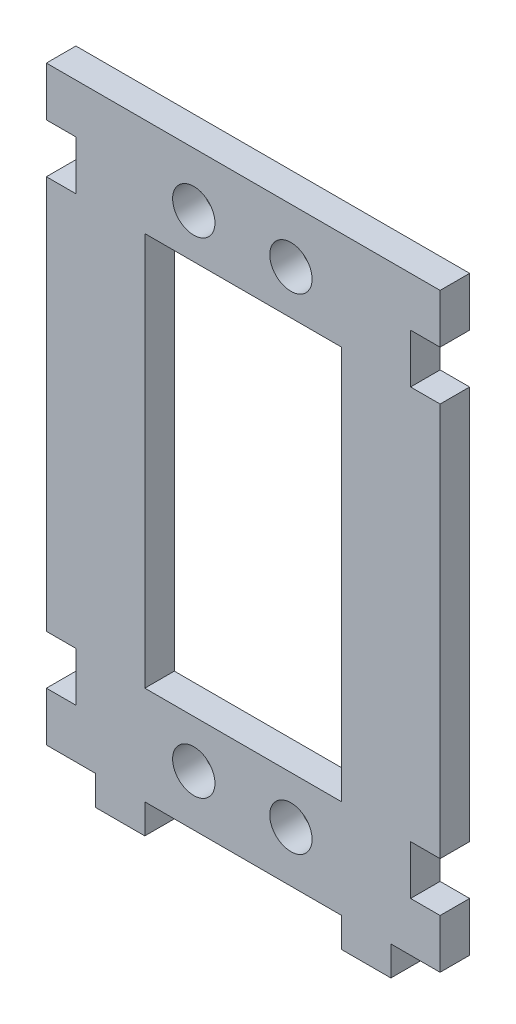
ISO-10303-21;
HEADER;
FILE_DESCRIPTION(('STEP AP214'),'2;1');
FILE_NAME('part.step','',(''),(''),'','','');
FILE_SCHEMA(('AUTOMOTIVE_DESIGN { 1 0 10303 214 1 1 1 1 }'));
ENDSEC;
DATA;
#1=APPLICATION_CONTEXT('core data for automotive mechanical design processes');
#2=APPLICATION_PROTOCOL_DEFINITION('international standard','automotive_design',2000,#1);
#3=PRODUCT_CONTEXT('',#1,'mechanical');
#4=PRODUCT('Part','Part','',(#3));
#5=PRODUCT_RELATED_PRODUCT_CATEGORY('part','',(#4));
#6=PRODUCT_DEFINITION_FORMATION('','',#4);
#7=PRODUCT_DEFINITION_CONTEXT('part definition',#1,'design');
#8=PRODUCT_DEFINITION('design','',#6,#7);
#9=PRODUCT_DEFINITION_SHAPE('','',#8);
#10=(LENGTH_UNIT() NAMED_UNIT(*) SI_UNIT(.MILLI.,.METRE.));
#11=(NAMED_UNIT(*) PLANE_ANGLE_UNIT() SI_UNIT($,.RADIAN.));
#12=(NAMED_UNIT(*) SI_UNIT($,.STERADIAN.) SOLID_ANGLE_UNIT());
#13=UNCERTAINTY_MEASURE_WITH_UNIT(LENGTH_MEASURE(1.E-05),#10,'distance_accuracy_value','');
#14=(GEOMETRIC_REPRESENTATION_CONTEXT(3) GLOBAL_UNCERTAINTY_ASSIGNED_CONTEXT((#13)) GLOBAL_UNIT_ASSIGNED_CONTEXT((#10,
#11,#12)) REPRESENTATION_CONTEXT('',''));
#15=CARTESIAN_POINT('',(0.,0.,0.));
#16=DIRECTION('',(0.,0.,1.));
#17=DIRECTION('',(1.,0.,0.));
#18=AXIS2_PLACEMENT_3D('',#15,#16,#17);
#19=CARTESIAN_POINT('',(20.,-30.,3.));
#20=DIRECTION('',(-1.,0.,0.));
#21=DIRECTION('',(0.,0.,1.));
#22=AXIS2_PLACEMENT_3D('',#19,#20,#21);
#23=PLANE('',#22);
#24=DIRECTION('',(0.,1.,0.));
#25=VECTOR('',#24,1.);
#26=CARTESIAN_POINT('',(20.,-30.,0.));
#27=LINE('',#26,#25);
#28=CARTESIAN_POINT('',(20.,-20.,0.));
#29=VERTEX_POINT('',#28);
#30=CARTESIAN_POINT('',(20.,20.,0.));
#31=VERTEX_POINT('',#30);
#32=EDGE_CURVE('E486',#29,#31,#27,.T.);
#33=ORIENTED_EDGE('',*,*,#32,.T.);
#34=DIRECTION('',(0.,0.,-1.));
#35=VECTOR('',#34,1.);
#36=CARTESIAN_POINT('',(20.,20.,3.));
#37=LINE('',#36,#35);
#38=CARTESIAN_POINT('',(20.,20.,3.));
#39=VERTEX_POINT('',#38);
#40=EDGE_CURVE('E278',#39,#31,#37,.T.);
#41=ORIENTED_EDGE('',*,*,#40,.F.);
#42=DIRECTION('',(0.,1.,0.));
#43=VECTOR('',#42,1.);
#44=CARTESIAN_POINT('',(20.,-30.,3.));
#45=LINE('',#44,#43);
#46=CARTESIAN_POINT('',(20.,-20.,3.));
#47=VERTEX_POINT('',#46);
#48=EDGE_CURVE('E468',#47,#39,#45,.T.);
#49=ORIENTED_EDGE('',*,*,#48,.F.);
#50=DIRECTION('',(0.,0.,-1.));
#51=VECTOR('',#50,1.);
#52=CARTESIAN_POINT('',(20.,-20.,3.));
#53=LINE('',#52,#51);
#54=EDGE_CURVE('E349',#47,#29,#53,.T.);
#55=ORIENTED_EDGE('',*,*,#54,.T.);
#56=EDGE_LOOP('',(#33,#41,#49,#55));
#57=FACE_BOUND('',#56,.T.);
#58=ADVANCED_FACE('F33',(#57),#23,.F.);
#59=CARTESIAN_POINT('',(20.,-30.,0.));
#60=VERTEX_POINT('',#59);
#61=CARTESIAN_POINT('',(20.,-25.,0.));
#62=VERTEX_POINT('',#61);
#63=EDGE_CURVE('E482',#60,#62,#27,.T.);
#64=ORIENTED_EDGE('',*,*,#63,.T.);
#65=DIRECTION('',(0.,0.,-1.));
#66=VECTOR('',#65,1.);
#67=CARTESIAN_POINT('',(20.,-25.,3.));
#68=LINE('',#67,#66);
#69=CARTESIAN_POINT('',(20.,-25.,3.));
#70=VERTEX_POINT('',#69);
#71=EDGE_CURVE('E347',#70,#62,#68,.T.);
#72=ORIENTED_EDGE('',*,*,#71,.F.);
#73=CARTESIAN_POINT('',(20.,-30.,3.));
#74=VERTEX_POINT('',#73);
#75=EDGE_CURVE('E464',#74,#70,#45,.T.);
#76=ORIENTED_EDGE('',*,*,#75,.F.);
#77=DIRECTION('',(0.,0.,-1.));
#78=VECTOR('',#77,1.);
#79=CARTESIAN_POINT('',(20.,-30.,3.));
#80=LINE('',#79,#78);
#81=EDGE_CURVE('E480',#74,#60,#80,.T.);
#82=ORIENTED_EDGE('',*,*,#81,.T.);
#83=EDGE_LOOP('',(#64,#72,#76,#82));
#84=FACE_BOUND('',#83,.T.);
#85=ADVANCED_FACE('F545',(#84),#23,.F.);
#86=CARTESIAN_POINT('',(-20.,-30.,3.));
#87=DIRECTION('',(1.,0.,0.));
#88=DIRECTION('',(0.,0.,-1.));
#89=AXIS2_PLACEMENT_3D('',#86,#87,#88);
#90=PLANE('',#89);
#91=DIRECTION('',(0.,-1.,0.));
#92=VECTOR('',#91,1.);
#93=CARTESIAN_POINT('',(-20.,-30.,0.));
#94=LINE('',#93,#92);
#95=CARTESIAN_POINT('',(-20.,20.,0.));
#96=VERTEX_POINT('',#95);
#97=CARTESIAN_POINT('',(-20.,-20.,0.));
#98=VERTEX_POINT('',#97);
#99=EDGE_CURVE('E493',#96,#98,#94,.T.);
#100=ORIENTED_EDGE('',*,*,#99,.T.);
#101=DIRECTION('',(0.,0.,-1.));
#102=VECTOR('',#101,1.);
#103=CARTESIAN_POINT('',(-20.,-20.,3.));
#104=LINE('',#103,#102);
#105=CARTESIAN_POINT('',(-20.,-20.,3.));
#106=VERTEX_POINT('',#105);
#107=EDGE_CURVE('E322',#106,#98,#104,.T.);
#108=ORIENTED_EDGE('',*,*,#107,.F.);
#109=DIRECTION('',(0.,-1.,0.));
#110=VECTOR('',#109,1.);
#111=CARTESIAN_POINT('',(-20.,-30.,3.));
#112=LINE('',#111,#110);
#113=CARTESIAN_POINT('',(-20.,20.,3.));
#114=VERTEX_POINT('',#113);
#115=EDGE_CURVE('E476',#114,#106,#112,.T.);
#116=ORIENTED_EDGE('',*,*,#115,.F.);
#117=DIRECTION('',(0.,0.,-1.));
#118=VECTOR('',#117,1.);
#119=CARTESIAN_POINT('',(-20.,20.,3.));
#120=LINE('',#119,#118);
#121=EDGE_CURVE('E301',#114,#96,#120,.T.);
#122=ORIENTED_EDGE('',*,*,#121,.T.);
#123=EDGE_LOOP('',(#100,#108,#116,#122));
#124=FACE_BOUND('',#123,.T.);
#125=ADVANCED_FACE('F550',(#124),#90,.F.);
#126=CARTESIAN_POINT('',(-20.,30.,0.));
#127=VERTEX_POINT('',#126);
#128=CARTESIAN_POINT('',(-20.,25.,0.));
#129=VERTEX_POINT('',#128);
#130=EDGE_CURVE('E489',#127,#129,#94,.T.);
#131=ORIENTED_EDGE('',*,*,#130,.T.);
#132=DIRECTION('',(0.,0.,-1.));
#133=VECTOR('',#132,1.);
#134=CARTESIAN_POINT('',(-20.,25.,3.));
#135=LINE('',#134,#133);
#136=CARTESIAN_POINT('',(-20.,25.,3.));
#137=VERTEX_POINT('',#136);
#138=EDGE_CURVE('E299',#137,#129,#135,.T.);
#139=ORIENTED_EDGE('',*,*,#138,.F.);
#140=CARTESIAN_POINT('',(-20.,30.,3.));
#141=VERTEX_POINT('',#140);
#142=EDGE_CURVE('E472',#141,#137,#112,.T.);
#143=ORIENTED_EDGE('',*,*,#142,.F.);
#144=DIRECTION('',(0.,0.,-1.));
#145=VECTOR('',#144,1.);
#146=CARTESIAN_POINT('',(-20.,30.,3.));
#147=LINE('',#146,#145);
#148=EDGE_CURVE('E41',#141,#127,#147,.T.);
#149=ORIENTED_EDGE('',*,*,#148,.T.);
#150=EDGE_LOOP('',(#131,#139,#143,#149));
#151=FACE_BOUND('',#150,.T.);
#152=ADVANCED_FACE('F506',(#151),#90,.F.);
#153=CARTESIAN_POINT('',(-20.,-30.,3.));
#154=DIRECTION('',(0.,1.,0.));
#155=DIRECTION('',(0.,0.,1.));
#156=AXIS2_PLACEMENT_3D('',#153,#154,#155);
#157=PLANE('',#156);
#158=DIRECTION('',(0.,0.,-1.));
#159=VECTOR('',#158,1.);
#160=CARTESIAN_POINT('',(-15.,-30.,3.));
#161=LINE('',#160,#159);
#162=CARTESIAN_POINT('',(-15.,-30.,3.));
#163=VERTEX_POINT('',#162);
#164=CARTESIAN_POINT('',(-15.,-30.,0.));
#165=VERTEX_POINT('',#164);
#166=EDGE_CURVE('E346',#163,#165,#161,.T.);
#167=ORIENTED_EDGE('',*,*,#166,.F.);
#168=DIRECTION('',(1.,0.,0.));
#169=VECTOR('',#168,1.);
#170=CARTESIAN_POINT('',(-20.,-30.,3.));
#171=LINE('',#170,#169);
#172=CARTESIAN_POINT('',(-20.,-30.,3.));
#173=VERTEX_POINT('',#172);
#174=EDGE_CURVE('E477',#173,#163,#171,.T.);
#175=ORIENTED_EDGE('',*,*,#174,.F.);
#176=DIRECTION('',(0.,0.,-1.));
#177=VECTOR('',#176,1.);
#178=CARTESIAN_POINT('',(-20.,-30.,3.));
#179=LINE('',#178,#177);
#180=CARTESIAN_POINT('',(-20.,-30.,0.));
#181=VERTEX_POINT('',#180);
#182=EDGE_CURVE('E499',#173,#181,#179,.T.);
#183=ORIENTED_EDGE('',*,*,#182,.T.);
#184=DIRECTION('',(1.,0.,0.));
#185=VECTOR('',#184,1.);
#186=CARTESIAN_POINT('',(-20.,-30.,0.));
#187=LINE('',#186,#185);
#188=EDGE_CURVE('E494',#181,#165,#187,.T.);
#189=ORIENTED_EDGE('',*,*,#188,.T.);
#190=EDGE_LOOP('',(#167,#175,#183,#189));
#191=FACE_BOUND('',#190,.T.);
#192=ADVANCED_FACE('F564',(#191),#157,.F.);
#193=DIRECTION('',(0.,0.,1.));
#194=VECTOR('',#193,1.);
#195=CARTESIAN_POINT('',(-10.,-30.,3.));
#196=LINE('',#195,#194);
#197=CARTESIAN_POINT('',(-10.,-30.,0.));
#198=VERTEX_POINT('',#197);
#199=CARTESIAN_POINT('',(-10.,-30.,3.));
#200=VERTEX_POINT('',#199);
#201=EDGE_CURVE('E358',#198,#200,#196,.T.);
#202=ORIENTED_EDGE('',*,*,#201,.F.);
#203=CARTESIAN_POINT('',(10.,-30.,0.));
#204=VERTEX_POINT('',#203);
#205=EDGE_CURVE('E496',#198,#204,#187,.T.);
#206=ORIENTED_EDGE('',*,*,#205,.T.);
#207=DIRECTION('',(0.,0.,-1.));
#208=VECTOR('',#207,1.);
#209=CARTESIAN_POINT('',(10.,-30.,0.));
#210=LINE('',#209,#208);
#211=CARTESIAN_POINT('',(10.,-30.,3.));
#212=VERTEX_POINT('',#211);
#213=EDGE_CURVE('E385',#212,#204,#210,.T.);
#214=ORIENTED_EDGE('',*,*,#213,.F.);
#215=EDGE_CURVE('E481',#200,#212,#171,.T.);
#216=ORIENTED_EDGE('',*,*,#215,.F.);
#217=EDGE_LOOP('',(#202,#206,#214,#216));
#218=FACE_BOUND('',#217,.T.);
#219=ADVANCED_FACE('F561',(#218),#157,.F.);
#220=DIRECTION('',(0.,0.,1.));
#221=VECTOR('',#220,1.);
#222=CARTESIAN_POINT('',(15.,-30.,0.));
#223=LINE('',#222,#221);
#224=CARTESIAN_POINT('',(15.,-30.,0.));
#225=VERTEX_POINT('',#224);
#226=CARTESIAN_POINT('',(15.,-30.,3.));
#227=VERTEX_POINT('',#226);
#228=EDGE_CURVE('E380',#225,#227,#223,.T.);
#229=ORIENTED_EDGE('',*,*,#228,.F.);
#230=EDGE_CURVE('E492',#225,#60,#187,.T.);
#231=ORIENTED_EDGE('',*,*,#230,.T.);
#232=ORIENTED_EDGE('',*,*,#81,.F.);
#233=EDGE_CURVE('E475',#227,#74,#171,.T.);
#234=ORIENTED_EDGE('',*,*,#233,.F.);
#235=EDGE_LOOP('',(#229,#231,#232,#234));
#236=FACE_BOUND('',#235,.T.);
#237=ADVANCED_FACE('F553',(#236),#157,.F.);
#238=CARTESIAN_POINT('',(20.,25.,3.));
#239=VERTEX_POINT('',#238);
#240=CARTESIAN_POINT('',(20.,30.,3.));
#241=VERTEX_POINT('',#240);
#242=EDGE_CURVE('E469',#239,#241,#45,.T.);
#243=ORIENTED_EDGE('',*,*,#242,.F.);
#244=DIRECTION('',(0.,0.,-1.));
#245=VECTOR('',#244,1.);
#246=CARTESIAN_POINT('',(20.,25.,3.));
#247=LINE('',#246,#245);
#248=CARTESIAN_POINT('',(20.,25.,0.));
#249=VERTEX_POINT('',#248);
#250=EDGE_CURVE('E252',#239,#249,#247,.T.);
#251=ORIENTED_EDGE('',*,*,#250,.T.);
#252=CARTESIAN_POINT('',(20.,30.,0.));
#253=VERTEX_POINT('',#252);
#254=EDGE_CURVE('E457',#249,#253,#27,.T.);
#255=ORIENTED_EDGE('',*,*,#254,.T.);
#256=DIRECTION('',(0.,0.,-1.));
#257=VECTOR('',#256,1.);
#258=CARTESIAN_POINT('',(20.,30.,3.));
#259=LINE('',#258,#257);
#260=EDGE_CURVE('E11',#241,#253,#259,.T.);
#261=ORIENTED_EDGE('',*,*,#260,.F.);
#262=EDGE_LOOP('',(#243,#251,#255,#261));
#263=FACE_BOUND('',#262,.T.);
#264=ADVANCED_FACE('F35',(#263),#23,.F.);
#265=CARTESIAN_POINT('',(-20.,30.,3.));
#266=DIRECTION('',(0.,-1.,0.));
#267=DIRECTION('',(0.,0.,-1.));
#268=AXIS2_PLACEMENT_3D('',#265,#266,#267);
#269=PLANE('',#268);
#270=DIRECTION('',(-1.,0.,0.));
#271=VECTOR('',#270,1.);
#272=CARTESIAN_POINT('',(-20.,30.,0.));
#273=LINE('',#272,#271);
#274=EDGE_CURVE('E485',#253,#127,#273,.T.);
#275=ORIENTED_EDGE('',*,*,#274,.T.);
#276=ORIENTED_EDGE('',*,*,#148,.F.);
#277=DIRECTION('',(-1.,0.,0.));
#278=VECTOR('',#277,1.);
#279=CARTESIAN_POINT('',(-20.,30.,3.));
#280=LINE('',#279,#278);
#281=EDGE_CURVE('E467',#241,#141,#280,.T.);
#282=ORIENTED_EDGE('',*,*,#281,.F.);
#283=ORIENTED_EDGE('',*,*,#260,.T.);
#284=EDGE_LOOP('',(#275,#276,#282,#283));
#285=FACE_BOUND('',#284,.T.);
#286=ADVANCED_FACE('F522',(#285),#269,.F.);
#287=CARTESIAN_POINT('',(-20.,-25.,3.));
#288=VERTEX_POINT('',#287);
#289=EDGE_CURVE('E471',#288,#173,#112,.T.);
#290=ORIENTED_EDGE('',*,*,#289,.F.);
#291=DIRECTION('',(0.,0.,-1.));
#292=VECTOR('',#291,1.);
#293=CARTESIAN_POINT('',(-20.,-25.,3.));
#294=LINE('',#293,#292);
#295=CARTESIAN_POINT('',(-20.,-25.,0.));
#296=VERTEX_POINT('',#295);
#297=EDGE_CURVE('E324',#288,#296,#294,.T.);
#298=ORIENTED_EDGE('',*,*,#297,.T.);
#299=EDGE_CURVE('E488',#296,#181,#94,.T.);
#300=ORIENTED_EDGE('',*,*,#299,.T.);
#301=ORIENTED_EDGE('',*,*,#182,.F.);
#302=EDGE_LOOP('',(#290,#298,#300,#301));
#303=FACE_BOUND('',#302,.T.);
#304=ADVANCED_FACE('F559',(#303),#90,.F.);
#305=CARTESIAN_POINT('',(0.,0.,3.));
#306=DIRECTION('',(0.,0.,-1.));
#307=DIRECTION('',(-1.,0.,0.));
#308=AXIS2_PLACEMENT_3D('',#305,#306,#307);
#309=PLANE('',#308);
#310=CARTESIAN_POINT('',(4.84500000000004,-24.8099999999996,3.));
#311=DIRECTION('',(0.,0.,1.));
#312=DIRECTION('',(1.,0.,0.));
#313=AXIS2_PLACEMENT_3D('',#310,#311,#312);
#314=CIRCLE('',#313,2.15);
#315=CARTESIAN_POINT('',(6.99500000000004,-24.8099999999996,3.));
#316=VERTEX_POINT('',#315);
#317=EDGE_CURVE('E407',#316,#316,#314,.T.);
#318=ORIENTED_EDGE('',*,*,#317,.F.);
#319=EDGE_LOOP('',(#318));
#320=FACE_BOUND('',#319,.T.);
#321=CARTESIAN_POINT('',(-5.02499999999992,-24.8099999999996,3.));
#322=DIRECTION('',(0.,0.,1.));
#323=DIRECTION('',(1.,0.,0.));
#324=AXIS2_PLACEMENT_3D('',#321,#322,#323);
#325=CIRCLE('',#324,2.15);
#326=CARTESIAN_POINT('',(-2.87499999999992,-24.8099999999996,3.));
#327=VERTEX_POINT('',#326);
#328=EDGE_CURVE('E424',#327,#327,#325,.T.);
#329=ORIENTED_EDGE('',*,*,#328,.F.);
#330=EDGE_LOOP('',(#329));
#331=FACE_BOUND('',#330,.T.);
#332=CARTESIAN_POINT('',(-5.02499999999977,24.4900000000004,3.));
#333=DIRECTION('',(0.,0.,1.));
#334=DIRECTION('',(1.,0.,0.));
#335=AXIS2_PLACEMENT_3D('',#332,#333,#334);
#336=CIRCLE('',#335,2.15);
#337=CARTESIAN_POINT('',(-2.87499999999977,24.4900000000004,3.));
#338=VERTEX_POINT('',#337);
#339=EDGE_CURVE('E418',#338,#338,#336,.T.);
#340=ORIENTED_EDGE('',*,*,#339,.F.);
#341=EDGE_LOOP('',(#340));
#342=FACE_BOUND('',#341,.T.);
#343=CARTESIAN_POINT('',(4.84500000000023,24.4900000000004,3.));
#344=DIRECTION('',(0.,0.,1.));
#345=DIRECTION('',(1.,0.,0.));
#346=AXIS2_PLACEMENT_3D('',#343,#344,#345);
#347=CIRCLE('',#346,2.15);
#348=CARTESIAN_POINT('',(6.99500000000023,24.4900000000004,3.));
#349=VERTEX_POINT('',#348);
#350=EDGE_CURVE('E412',#349,#349,#347,.T.);
#351=ORIENTED_EDGE('',*,*,#350,.F.);
#352=EDGE_LOOP('',(#351));
#353=FACE_BOUND('',#352,.T.);
#354=DIRECTION('',(-1.,0.,0.));
#355=VECTOR('',#354,1.);
#356=CARTESIAN_POINT('',(-10.,20.,3.));
#357=LINE('',#356,#355);
#358=CARTESIAN_POINT('',(10.,20.,3.));
#359=VERTEX_POINT('',#358);
#360=CARTESIAN_POINT('',(-10.,20.,3.));
#361=VERTEX_POINT('',#360);
#362=EDGE_CURVE('E447',#359,#361,#357,.T.);
#363=ORIENTED_EDGE('',*,*,#362,.F.);
#364=DIRECTION('',(0.,1.,0.));
#365=VECTOR('',#364,1.);
#366=CARTESIAN_POINT('',(10.,-20.,3.));
#367=LINE('',#366,#365);
#368=CARTESIAN_POINT('',(10.,-20.,3.));
#369=VERTEX_POINT('',#368);
#370=EDGE_CURVE('E411',#369,#359,#367,.T.);
#371=ORIENTED_EDGE('',*,*,#370,.F.);
#372=DIRECTION('',(1.,0.,0.));
#373=VECTOR('',#372,1.);
#374=CARTESIAN_POINT('',(-10.,-20.,3.));
#375=LINE('',#374,#373);
#376=CARTESIAN_POINT('',(-10.,-20.,3.));
#377=VERTEX_POINT('',#376);
#378=EDGE_CURVE('E436',#377,#369,#375,.T.);
#379=ORIENTED_EDGE('',*,*,#378,.F.);
#380=DIRECTION('',(0.,-1.,0.));
#381=VECTOR('',#380,1.);
#382=CARTESIAN_POINT('',(-10.,-20.,3.));
#383=LINE('',#382,#381);
#384=EDGE_CURVE('E450',#361,#377,#383,.T.);
#385=ORIENTED_EDGE('',*,*,#384,.F.);
#386=EDGE_LOOP('',(#363,#371,#379,#385));
#387=FACE_BOUND('',#386,.T.);
#388=ORIENTED_EDGE('',*,*,#115,.T.);
#389=DIRECTION('',(1.,0.,0.));
#390=VECTOR('',#389,1.);
#391=CARTESIAN_POINT('',(-17.,-20.,3.));
#392=LINE('',#391,#390);
#393=CARTESIAN_POINT('',(-17.,-20.,3.));
#394=VERTEX_POINT('',#393);
#395=EDGE_CURVE('E312',#106,#394,#392,.T.);
#396=ORIENTED_EDGE('',*,*,#395,.T.);
#397=DIRECTION('',(0.,-1.,0.));
#398=VECTOR('',#397,1.);
#399=CARTESIAN_POINT('',(-17.,-25.,3.));
#400=LINE('',#399,#398);
#401=CARTESIAN_POINT('',(-17.,-25.,3.));
#402=VERTEX_POINT('',#401);
#403=EDGE_CURVE('E305',#394,#402,#400,.T.);
#404=ORIENTED_EDGE('',*,*,#403,.T.);
#405=DIRECTION('',(-1.,0.,0.));
#406=VECTOR('',#405,1.);
#407=CARTESIAN_POINT('',(-17.,-25.,3.));
#408=LINE('',#407,#406);
#409=EDGE_CURVE('E308',#402,#288,#408,.T.);
#410=ORIENTED_EDGE('',*,*,#409,.T.);
#411=ORIENTED_EDGE('',*,*,#289,.T.);
#412=ORIENTED_EDGE('',*,*,#174,.T.);
#413=DIRECTION('',(0.,1.,0.));
#414=VECTOR('',#413,1.);
#415=CARTESIAN_POINT('',(-15.,-33.,3.));
#416=LINE('',#415,#414);
#417=CARTESIAN_POINT('',(-15.,-33.,3.));
#418=VERTEX_POINT('',#417);
#419=EDGE_CURVE('E364',#418,#163,#416,.T.);
#420=ORIENTED_EDGE('',*,*,#419,.F.);
#421=DIRECTION('',(-1.,0.,0.));
#422=VECTOR('',#421,1.);
#423=CARTESIAN_POINT('',(-15.,-33.,3.));
#424=LINE('',#423,#422);
#425=CARTESIAN_POINT('',(-10.,-33.,3.));
#426=VERTEX_POINT('',#425);
#427=EDGE_CURVE('E362',#426,#418,#424,.T.);
#428=ORIENTED_EDGE('',*,*,#427,.F.);
#429=DIRECTION('',(0.,1.,0.));
#430=VECTOR('',#429,1.);
#431=CARTESIAN_POINT('',(-10.,-33.,3.));
#432=LINE('',#431,#430);
#433=EDGE_CURVE('E371',#426,#200,#432,.T.);
#434=ORIENTED_EDGE('',*,*,#433,.T.);
#435=ORIENTED_EDGE('',*,*,#215,.T.);
#436=DIRECTION('',(0.,1.,0.));
#437=VECTOR('',#436,1.);
#438=CARTESIAN_POINT('',(10.,-33.,3.));
#439=LINE('',#438,#437);
#440=CARTESIAN_POINT('',(10.,-33.,3.));
#441=VERTEX_POINT('',#440);
#442=EDGE_CURVE('E401',#441,#212,#439,.T.);
#443=ORIENTED_EDGE('',*,*,#442,.F.);
#444=DIRECTION('',(-1.,0.,0.));
#445=VECTOR('',#444,1.);
#446=CARTESIAN_POINT('',(15.,-33.,3.));
#447=LINE('',#446,#445);
#448=CARTESIAN_POINT('',(15.,-33.,3.));
#449=VERTEX_POINT('',#448);
#450=EDGE_CURVE('E384',#449,#441,#447,.T.);
#451=ORIENTED_EDGE('',*,*,#450,.F.);
#452=DIRECTION('',(0.,1.,0.));
#453=VECTOR('',#452,1.);
#454=CARTESIAN_POINT('',(15.,-33.,3.));
#455=LINE('',#454,#453);
#456=EDGE_CURVE('E404',#449,#227,#455,.T.);
#457=ORIENTED_EDGE('',*,*,#456,.T.);
#458=ORIENTED_EDGE('',*,*,#233,.T.);
#459=ORIENTED_EDGE('',*,*,#75,.T.);
#460=DIRECTION('',(-1.,0.,0.));
#461=VECTOR('',#460,1.);
#462=CARTESIAN_POINT('',(17.,-25.,3.));
#463=LINE('',#462,#461);
#464=CARTESIAN_POINT('',(17.,-25.,3.));
#465=VERTEX_POINT('',#464);
#466=EDGE_CURVE('E335',#70,#465,#463,.T.);
#467=ORIENTED_EDGE('',*,*,#466,.T.);
#468=DIRECTION('',(0.,1.,0.));
#469=VECTOR('',#468,1.);
#470=CARTESIAN_POINT('',(17.,-25.,3.));
#471=LINE('',#470,#469);
#472=CARTESIAN_POINT('',(17.,-20.,3.));
#473=VERTEX_POINT('',#472);
#474=EDGE_CURVE('E328',#465,#473,#471,.T.);
#475=ORIENTED_EDGE('',*,*,#474,.T.);
#476=DIRECTION('',(1.,0.,0.));
#477=VECTOR('',#476,1.);
#478=CARTESIAN_POINT('',(17.,-20.,3.));
#479=LINE('',#478,#477);
#480=EDGE_CURVE('E331',#473,#47,#479,.T.);
#481=ORIENTED_EDGE('',*,*,#480,.T.);
#482=ORIENTED_EDGE('',*,*,#48,.T.);
#483=DIRECTION('',(-1.,0.,0.));
#484=VECTOR('',#483,1.);
#485=CARTESIAN_POINT('',(17.,20.,3.));
#486=LINE('',#485,#484);
#487=CARTESIAN_POINT('',(17.,20.,3.));
#488=VERTEX_POINT('',#487);
#489=EDGE_CURVE('E253',#39,#488,#486,.T.);
#490=ORIENTED_EDGE('',*,*,#489,.T.);
#491=DIRECTION('',(0.,1.,0.));
#492=VECTOR('',#491,1.);
#493=CARTESIAN_POINT('',(17.,20.,3.));
#494=LINE('',#493,#492);
#495=CARTESIAN_POINT('',(17.,25.,3.));
#496=VERTEX_POINT('',#495);
#497=EDGE_CURVE('E246',#488,#496,#494,.T.);
#498=ORIENTED_EDGE('',*,*,#497,.T.);
#499=DIRECTION('',(1.,0.,0.));
#500=VECTOR('',#499,1.);
#501=CARTESIAN_POINT('',(17.,25.,3.));
#502=LINE('',#501,#500);
#503=EDGE_CURVE('E256',#496,#239,#502,.T.);
#504=ORIENTED_EDGE('',*,*,#503,.T.);
#505=ORIENTED_EDGE('',*,*,#242,.T.);
#506=ORIENTED_EDGE('',*,*,#281,.T.);
#507=ORIENTED_EDGE('',*,*,#142,.T.);
#508=DIRECTION('',(1.,0.,0.));
#509=VECTOR('',#508,1.);
#510=CARTESIAN_POINT('',(-17.,25.,3.));
#511=LINE('',#510,#509);
#512=CARTESIAN_POINT('',(-17.,25.,3.));
#513=VERTEX_POINT('',#512);
#514=EDGE_CURVE('E288',#137,#513,#511,.T.);
#515=ORIENTED_EDGE('',*,*,#514,.T.);
#516=DIRECTION('',(0.,-1.,0.));
#517=VECTOR('',#516,1.);
#518=CARTESIAN_POINT('',(-17.,20.,3.));
#519=LINE('',#518,#517);
#520=CARTESIAN_POINT('',(-17.,20.,3.));
#521=VERTEX_POINT('',#520);
#522=EDGE_CURVE('E281',#513,#521,#519,.T.);
#523=ORIENTED_EDGE('',*,*,#522,.T.);
#524=DIRECTION('',(-1.,0.,0.));
#525=VECTOR('',#524,1.);
#526=CARTESIAN_POINT('',(-17.,20.,3.));
#527=LINE('',#526,#525);
#528=EDGE_CURVE('E284',#521,#114,#527,.T.);
#529=ORIENTED_EDGE('',*,*,#528,.T.);
#530=EDGE_LOOP('',(#388,#396,#404,#410,#411,#412,#420,#428,#434,#435,#443,#451,#457,#458,#459,
#467,#475,#481,#482,#490,#498,#504,#505,#506,#507,#515,#523,#529));
#531=FACE_BOUND('',#530,.T.);
#532=ADVANCED_FACE('F263',(#320,#331,#342,#353,#387,#531),#309,.F.);
#533=CARTESIAN_POINT('',(0.,0.,0.));
#534=DIRECTION('',(0.,0.,-1.));
#535=DIRECTION('',(-1.,0.,0.));
#536=AXIS2_PLACEMENT_3D('',#533,#534,#535);
#537=PLANE('',#536);
#538=DIRECTION('',(1.,0.,0.));
#539=VECTOR('',#538,1.);
#540=CARTESIAN_POINT('',(-17.,-20.,0.));
#541=LINE('',#540,#539);
#542=CARTESIAN_POINT('',(-17.,-20.,0.));
#543=VERTEX_POINT('',#542);
#544=EDGE_CURVE('E309',#98,#543,#541,.T.);
#545=ORIENTED_EDGE('',*,*,#544,.F.);
#546=ORIENTED_EDGE('',*,*,#99,.F.);
#547=DIRECTION('',(-1.,0.,0.));
#548=VECTOR('',#547,1.);
#549=CARTESIAN_POINT('',(-17.,20.,0.));
#550=LINE('',#549,#548);
#551=CARTESIAN_POINT('',(-17.,20.,0.));
#552=VERTEX_POINT('',#551);
#553=EDGE_CURVE('E293',#552,#96,#550,.T.);
#554=ORIENTED_EDGE('',*,*,#553,.F.);
#555=DIRECTION('',(0.,-1.,0.));
#556=VECTOR('',#555,1.);
#557=CARTESIAN_POINT('',(-17.,20.,0.));
#558=LINE('',#557,#556);
#559=CARTESIAN_POINT('',(-17.,25.,0.));
#560=VERTEX_POINT('',#559);
#561=EDGE_CURVE('E56',#560,#552,#558,.T.);
#562=ORIENTED_EDGE('',*,*,#561,.F.);
#563=DIRECTION('',(1.,0.,0.));
#564=VECTOR('',#563,1.);
#565=CARTESIAN_POINT('',(-17.,25.,0.));
#566=LINE('',#565,#564);
#567=EDGE_CURVE('E285',#129,#560,#566,.T.);
#568=ORIENTED_EDGE('',*,*,#567,.F.);
#569=ORIENTED_EDGE('',*,*,#130,.F.);
#570=ORIENTED_EDGE('',*,*,#274,.F.);
#571=ORIENTED_EDGE('',*,*,#254,.F.);
#572=DIRECTION('',(1.,0.,0.));
#573=VECTOR('',#572,1.);
#574=CARTESIAN_POINT('',(17.,25.,0.));
#575=LINE('',#574,#573);
#576=CARTESIAN_POINT('',(17.,25.,0.));
#577=VERTEX_POINT('',#576);
#578=EDGE_CURVE('E268',#577,#249,#575,.T.);
#579=ORIENTED_EDGE('',*,*,#578,.F.);
#580=DIRECTION('',(0.,1.,0.));
#581=VECTOR('',#580,1.);
#582=CARTESIAN_POINT('',(17.,20.,0.));
#583=LINE('',#582,#581);
#584=CARTESIAN_POINT('',(17.,20.,0.));
#585=VERTEX_POINT('',#584);
#586=EDGE_CURVE('E249',#585,#577,#583,.T.);
#587=ORIENTED_EDGE('',*,*,#586,.F.);
#588=DIRECTION('',(-1.,0.,0.));
#589=VECTOR('',#588,1.);
#590=CARTESIAN_POINT('',(17.,20.,0.));
#591=LINE('',#590,#589);
#592=EDGE_CURVE('E265',#31,#585,#591,.T.);
#593=ORIENTED_EDGE('',*,*,#592,.F.);
#594=ORIENTED_EDGE('',*,*,#32,.F.);
#595=DIRECTION('',(1.,0.,0.));
#596=VECTOR('',#595,1.);
#597=CARTESIAN_POINT('',(17.,-20.,0.));
#598=LINE('',#597,#596);
#599=CARTESIAN_POINT('',(17.,-20.,0.));
#600=VERTEX_POINT('',#599);
#601=EDGE_CURVE('E340',#600,#29,#598,.T.);
#602=ORIENTED_EDGE('',*,*,#601,.F.);
#603=DIRECTION('',(0.,1.,0.));
#604=VECTOR('',#603,1.);
#605=CARTESIAN_POINT('',(17.,-25.,0.));
#606=LINE('',#605,#604);
#607=CARTESIAN_POINT('',(17.,-25.,0.));
#608=VERTEX_POINT('',#607);
#609=EDGE_CURVE('E277',#608,#600,#606,.T.);
#610=ORIENTED_EDGE('',*,*,#609,.F.);
#611=DIRECTION('',(-1.,0.,0.));
#612=VECTOR('',#611,1.);
#613=CARTESIAN_POINT('',(17.,-25.,0.));
#614=LINE('',#613,#612);
#615=EDGE_CURVE('E332',#62,#608,#614,.T.);
#616=ORIENTED_EDGE('',*,*,#615,.F.);
#617=ORIENTED_EDGE('',*,*,#63,.F.);
#618=ORIENTED_EDGE('',*,*,#230,.F.);
#619=DIRECTION('',(0.,1.,0.));
#620=VECTOR('',#619,1.);
#621=CARTESIAN_POINT('',(15.,-33.,0.));
#622=LINE('',#621,#620);
#623=CARTESIAN_POINT('',(15.,-33.,0.));
#624=VERTEX_POINT('',#623);
#625=EDGE_CURVE('E391',#624,#225,#622,.T.);
#626=ORIENTED_EDGE('',*,*,#625,.F.);
#627=DIRECTION('',(1.,0.,0.));
#628=VECTOR('',#627,1.);
#629=CARTESIAN_POINT('',(15.,-33.,0.));
#630=LINE('',#629,#628);
#631=CARTESIAN_POINT('',(10.,-33.,0.));
#632=VERTEX_POINT('',#631);
#633=EDGE_CURVE('E389',#632,#624,#630,.T.);
#634=ORIENTED_EDGE('',*,*,#633,.F.);
#635=DIRECTION('',(0.,1.,0.));
#636=VECTOR('',#635,1.);
#637=CARTESIAN_POINT('',(10.,-33.,0.));
#638=LINE('',#637,#636);
#639=EDGE_CURVE('E398',#632,#204,#638,.T.);
#640=ORIENTED_EDGE('',*,*,#639,.T.);
#641=ORIENTED_EDGE('',*,*,#205,.F.);
#642=DIRECTION('',(0.,1.,0.));
#643=VECTOR('',#642,1.);
#644=CARTESIAN_POINT('',(-10.,-33.,0.));
#645=LINE('',#644,#643);
#646=CARTESIAN_POINT('',(-10.,-33.,0.));
#647=VERTEX_POINT('',#646);
#648=EDGE_CURVE('E374',#647,#198,#645,.T.);
#649=ORIENTED_EDGE('',*,*,#648,.F.);
#650=DIRECTION('',(1.,0.,0.));
#651=VECTOR('',#650,1.);
#652=CARTESIAN_POINT('',(-15.,-33.,0.));
#653=LINE('',#652,#651);
#654=CARTESIAN_POINT('',(-15.,-33.,0.));
#655=VERTEX_POINT('',#654);
#656=EDGE_CURVE('E357',#655,#647,#653,.T.);
#657=ORIENTED_EDGE('',*,*,#656,.F.);
#658=DIRECTION('',(0.,1.,0.));
#659=VECTOR('',#658,1.);
#660=CARTESIAN_POINT('',(-15.,-33.,0.));
#661=LINE('',#660,#659);
#662=EDGE_CURVE('E377',#655,#165,#661,.T.);
#663=ORIENTED_EDGE('',*,*,#662,.T.);
#664=ORIENTED_EDGE('',*,*,#188,.F.);
#665=ORIENTED_EDGE('',*,*,#299,.F.);
#666=DIRECTION('',(-1.,0.,0.));
#667=VECTOR('',#666,1.);
#668=CARTESIAN_POINT('',(-17.,-25.,0.));
#669=LINE('',#668,#667);
#670=CARTESIAN_POINT('',(-17.,-25.,0.));
#671=VERTEX_POINT('',#670);
#672=EDGE_CURVE('E317',#671,#296,#669,.T.);
#673=ORIENTED_EDGE('',*,*,#672,.F.);
#674=DIRECTION('',(0.,-1.,0.));
#675=VECTOR('',#674,1.);
#676=CARTESIAN_POINT('',(-17.,-25.,0.));
#677=LINE('',#676,#675);
#678=EDGE_CURVE('E48',#543,#671,#677,.T.);
#679=ORIENTED_EDGE('',*,*,#678,.F.);
#680=EDGE_LOOP('',(#545,#546,#554,#562,#568,#569,#570,#571,#579,#587,#593,#594,#602,#610,#616,
#617,#618,#626,#634,#640,#641,#649,#657,#663,#664,#665,#673,#679));
#681=FACE_BOUND('',#680,.T.);
#682=CARTESIAN_POINT('',(4.84500000000004,-24.8099999999996,0.));
#683=DIRECTION('',(0.,0.,1.));
#684=DIRECTION('',(1.,0.,0.));
#685=AXIS2_PLACEMENT_3D('',#682,#683,#684);
#686=CIRCLE('',#685,2.15);
#687=CARTESIAN_POINT('',(6.99500000000004,-24.8099999999996,0.));
#688=VERTEX_POINT('',#687);
#689=EDGE_CURVE('E427',#688,#688,#686,.T.);
#690=ORIENTED_EDGE('',*,*,#689,.T.);
#691=EDGE_LOOP('',(#690));
#692=FACE_BOUND('',#691,.T.);
#693=CARTESIAN_POINT('',(-5.02499999999992,-24.8099999999996,0.));
#694=DIRECTION('',(0.,0.,1.));
#695=DIRECTION('',(1.,0.,0.));
#696=AXIS2_PLACEMENT_3D('',#693,#694,#695);
#697=CIRCLE('',#696,2.15);
#698=CARTESIAN_POINT('',(-2.87499999999992,-24.8099999999996,0.));
#699=VERTEX_POINT('',#698);
#700=EDGE_CURVE('E421',#699,#699,#697,.T.);
#701=ORIENTED_EDGE('',*,*,#700,.T.);
#702=EDGE_LOOP('',(#701));
#703=FACE_BOUND('',#702,.T.);
#704=CARTESIAN_POINT('',(-5.02499999999977,24.4900000000004,0.));
#705=DIRECTION('',(0.,0.,1.));
#706=DIRECTION('',(1.,0.,0.));
#707=AXIS2_PLACEMENT_3D('',#704,#705,#706);
#708=CIRCLE('',#707,2.15);
#709=CARTESIAN_POINT('',(-2.87499999999977,24.4900000000004,0.));
#710=VERTEX_POINT('',#709);
#711=EDGE_CURVE('E415',#710,#710,#708,.T.);
#712=ORIENTED_EDGE('',*,*,#711,.T.);
#713=EDGE_LOOP('',(#712));
#714=FACE_BOUND('',#713,.T.);
#715=CARTESIAN_POINT('',(4.84500000000023,24.4900000000004,0.));
#716=DIRECTION('',(0.,0.,1.));
#717=DIRECTION('',(1.,0.,0.));
#718=AXIS2_PLACEMENT_3D('',#715,#716,#717);
#719=CIRCLE('',#718,2.15);
#720=CARTESIAN_POINT('',(6.99500000000023,24.4900000000004,0.));
#721=VERTEX_POINT('',#720);
#722=EDGE_CURVE('E408',#721,#721,#719,.T.);
#723=ORIENTED_EDGE('',*,*,#722,.T.);
#724=EDGE_LOOP('',(#723));
#725=FACE_BOUND('',#724,.T.);
#726=DIRECTION('',(0.,1.,0.));
#727=VECTOR('',#726,1.);
#728=CARTESIAN_POINT('',(10.,-20.,0.));
#729=LINE('',#728,#727);
#730=CARTESIAN_POINT('',(10.,-20.,0.));
#731=VERTEX_POINT('',#730);
#732=CARTESIAN_POINT('',(10.,20.,0.));
#733=VERTEX_POINT('',#732);
#734=EDGE_CURVE('E432',#731,#733,#729,.T.);
#735=ORIENTED_EDGE('',*,*,#734,.T.);
#736=DIRECTION('',(-1.,0.,0.));
#737=VECTOR('',#736,1.);
#738=CARTESIAN_POINT('',(-10.,20.,0.));
#739=LINE('',#738,#737);
#740=CARTESIAN_POINT('',(-10.,20.,0.));
#741=VERTEX_POINT('',#740);
#742=EDGE_CURVE('E435',#733,#741,#739,.T.);
#743=ORIENTED_EDGE('',*,*,#742,.T.);
#744=DIRECTION('',(0.,-1.,0.));
#745=VECTOR('',#744,1.);
#746=CARTESIAN_POINT('',(-10.,-20.,0.));
#747=LINE('',#746,#745);
#748=CARTESIAN_POINT('',(-10.,-20.,0.));
#749=VERTEX_POINT('',#748);
#750=EDGE_CURVE('E439',#741,#749,#747,.T.);
#751=ORIENTED_EDGE('',*,*,#750,.T.);
#752=DIRECTION('',(1.,0.,0.));
#753=VECTOR('',#752,1.);
#754=CARTESIAN_POINT('',(-10.,-20.,0.));
#755=LINE('',#754,#753);
#756=EDGE_CURVE('E442',#749,#731,#755,.T.);
#757=ORIENTED_EDGE('',*,*,#756,.T.);
#758=EDGE_LOOP('',(#735,#743,#751,#757));
#759=FACE_BOUND('',#758,.T.);
#760=ADVANCED_FACE('F514',(#681,#692,#703,#714,#725,#759),#537,.T.);
#761=CARTESIAN_POINT('',(10.,-20.,0.));
#762=DIRECTION('',(1.,0.,0.));
#763=DIRECTION('',(0.,0.,-1.));
#764=AXIS2_PLACEMENT_3D('',#761,#762,#763);
#765=PLANE('',#764);
#766=ORIENTED_EDGE('',*,*,#370,.T.);
#767=DIRECTION('',(0.,0.,1.));
#768=VECTOR('',#767,1.);
#769=CARTESIAN_POINT('',(10.,20.,0.));
#770=LINE('',#769,#768);
#771=EDGE_CURVE('E445',#733,#359,#770,.T.);
#772=ORIENTED_EDGE('',*,*,#771,.F.);
#773=ORIENTED_EDGE('',*,*,#734,.F.);
#774=DIRECTION('',(0.,0.,1.));
#775=VECTOR('',#774,1.);
#776=CARTESIAN_POINT('',(10.,-20.,0.));
#777=LINE('',#776,#775);
#778=EDGE_CURVE('E455',#731,#369,#777,.T.);
#779=ORIENTED_EDGE('',*,*,#778,.T.);
#780=EDGE_LOOP('',(#766,#772,#773,#779));
#781=FACE_BOUND('',#780,.T.);
#782=ADVANCED_FACE('F658',(#781),#765,.F.);
#783=CARTESIAN_POINT('',(-10.,-20.,0.));
#784=DIRECTION('',(0.,-1.,0.));
#785=DIRECTION('',(0.,0.,-1.));
#786=AXIS2_PLACEMENT_3D('',#783,#784,#785);
#787=PLANE('',#786);
#788=ORIENTED_EDGE('',*,*,#378,.T.);
#789=ORIENTED_EDGE('',*,*,#778,.F.);
#790=ORIENTED_EDGE('',*,*,#756,.F.);
#791=DIRECTION('',(0.,0.,1.));
#792=VECTOR('',#791,1.);
#793=CARTESIAN_POINT('',(-10.,-20.,0.));
#794=LINE('',#793,#792);
#795=EDGE_CURVE('E458',#749,#377,#794,.T.);
#796=ORIENTED_EDGE('',*,*,#795,.T.);
#797=EDGE_LOOP('',(#788,#789,#790,#796));
#798=FACE_BOUND('',#797,.T.);
#799=ADVANCED_FACE('F654',(#798),#787,.F.);
#800=CARTESIAN_POINT('',(-10.,-20.,0.));
#801=DIRECTION('',(-1.,0.,0.));
#802=DIRECTION('',(0.,0.,1.));
#803=AXIS2_PLACEMENT_3D('',#800,#801,#802);
#804=PLANE('',#803);
#805=ORIENTED_EDGE('',*,*,#384,.T.);
#806=ORIENTED_EDGE('',*,*,#795,.F.);
#807=ORIENTED_EDGE('',*,*,#750,.F.);
#808=DIRECTION('',(0.,0.,1.));
#809=VECTOR('',#808,1.);
#810=CARTESIAN_POINT('',(-10.,20.,0.));
#811=LINE('',#810,#809);
#812=EDGE_CURVE('E460',#741,#361,#811,.T.);
#813=ORIENTED_EDGE('',*,*,#812,.T.);
#814=EDGE_LOOP('',(#805,#806,#807,#813));
#815=FACE_BOUND('',#814,.T.);
#816=ADVANCED_FACE('F657',(#815),#804,.F.);
#817=CARTESIAN_POINT('',(-10.,20.,0.));
#818=DIRECTION('',(0.,1.,0.));
#819=DIRECTION('',(0.,0.,1.));
#820=AXIS2_PLACEMENT_3D('',#817,#818,#819);
#821=PLANE('',#820);
#822=ORIENTED_EDGE('',*,*,#362,.T.);
#823=ORIENTED_EDGE('',*,*,#812,.F.);
#824=ORIENTED_EDGE('',*,*,#742,.F.);
#825=ORIENTED_EDGE('',*,*,#771,.T.);
#826=EDGE_LOOP('',(#822,#823,#824,#825));
#827=FACE_BOUND('',#826,.T.);
#828=ADVANCED_FACE('F642',(#827),#821,.F.);
#829=CARTESIAN_POINT('',(4.84500000000023,24.4900000000004,0.));
#830=DIRECTION('',(0.,0.,1.));
#831=DIRECTION('',(1.,0.,0.));
#832=AXIS2_PLACEMENT_3D('',#829,#830,#831);
#833=CYLINDRICAL_SURFACE('',#832,2.15);
#834=ORIENTED_EDGE('',*,*,#722,.F.);
#835=EDGE_LOOP('',(#834));
#836=FACE_BOUND('',#835,.T.);
#837=ORIENTED_EDGE('',*,*,#350,.T.);
#838=EDGE_LOOP('',(#837));
#839=FACE_BOUND('',#838,.T.);
#840=ADVANCED_FACE('F638',(#836,#839),#833,.F.);
#841=CARTESIAN_POINT('',(-5.02499999999977,24.4900000000004,0.));
#842=DIRECTION('',(0.,0.,1.));
#843=DIRECTION('',(1.,0.,0.));
#844=AXIS2_PLACEMENT_3D('',#841,#842,#843);
#845=CYLINDRICAL_SURFACE('',#844,2.15);
#846=ORIENTED_EDGE('',*,*,#711,.F.);
#847=EDGE_LOOP('',(#846));
#848=FACE_BOUND('',#847,.T.);
#849=ORIENTED_EDGE('',*,*,#339,.T.);
#850=EDGE_LOOP('',(#849));
#851=FACE_BOUND('',#850,.T.);
#852=ADVANCED_FACE('F641',(#848,#851),#845,.F.);
#853=CARTESIAN_POINT('',(-5.02499999999992,-24.8099999999996,0.));
#854=DIRECTION('',(0.,0.,1.));
#855=DIRECTION('',(1.,0.,0.));
#856=AXIS2_PLACEMENT_3D('',#853,#854,#855);
#857=CYLINDRICAL_SURFACE('',#856,2.15);
#858=ORIENTED_EDGE('',*,*,#700,.F.);
#859=EDGE_LOOP('',(#858));
#860=FACE_BOUND('',#859,.T.);
#861=ORIENTED_EDGE('',*,*,#328,.T.);
#862=EDGE_LOOP('',(#861));
#863=FACE_BOUND('',#862,.T.);
#864=ADVANCED_FACE('F646',(#860,#863),#857,.F.);
#865=CARTESIAN_POINT('',(4.84500000000004,-24.8099999999996,0.));
#866=DIRECTION('',(0.,0.,1.));
#867=DIRECTION('',(1.,0.,0.));
#868=AXIS2_PLACEMENT_3D('',#865,#866,#867);
#869=CYLINDRICAL_SURFACE('',#868,2.15);
#870=ORIENTED_EDGE('',*,*,#689,.F.);
#871=EDGE_LOOP('',(#870));
#872=FACE_BOUND('',#871,.T.);
#873=ORIENTED_EDGE('',*,*,#317,.T.);
#874=EDGE_LOOP('',(#873));
#875=FACE_BOUND('',#874,.T.);
#876=ADVANCED_FACE('F636',(#872,#875),#869,.F.);
#877=CARTESIAN_POINT('',(15.,-33.,0.));
#878=DIRECTION('',(-1.,0.,0.));
#879=DIRECTION('',(0.,0.,1.));
#880=AXIS2_PLACEMENT_3D('',#877,#878,#879);
#881=PLANE('',#880);
#882=ORIENTED_EDGE('',*,*,#228,.T.);
#883=ORIENTED_EDGE('',*,*,#456,.F.);
#884=DIRECTION('',(0.,0.,1.));
#885=VECTOR('',#884,1.);
#886=CARTESIAN_POINT('',(15.,-33.,0.));
#887=LINE('',#886,#885);
#888=EDGE_CURVE('E381',#624,#449,#887,.T.);
#889=ORIENTED_EDGE('',*,*,#888,.F.);
#890=ORIENTED_EDGE('',*,*,#625,.T.);
#891=EDGE_LOOP('',(#882,#883,#889,#890));
#892=FACE_BOUND('',#891,.T.);
#893=ADVANCED_FACE('F632',(#892),#881,.F.);
#894=CARTESIAN_POINT('',(10.,-33.,0.));
#895=DIRECTION('',(1.,0.,0.));
#896=DIRECTION('',(0.,0.,-1.));
#897=AXIS2_PLACEMENT_3D('',#894,#895,#896);
#898=PLANE('',#897);
#899=ORIENTED_EDGE('',*,*,#213,.T.);
#900=ORIENTED_EDGE('',*,*,#639,.F.);
#901=DIRECTION('',(0.,0.,-1.));
#902=VECTOR('',#901,1.);
#903=CARTESIAN_POINT('',(10.,-33.,0.));
#904=LINE('',#903,#902);
#905=EDGE_CURVE('E387',#441,#632,#904,.T.);
#906=ORIENTED_EDGE('',*,*,#905,.F.);
#907=ORIENTED_EDGE('',*,*,#442,.T.);
#908=EDGE_LOOP('',(#899,#900,#906,#907));
#909=FACE_BOUND('',#908,.T.);
#910=ADVANCED_FACE('F628',(#909),#898,.F.);
#911=CARTESIAN_POINT('',(0.,-33.,0.));
#912=DIRECTION('',(0.,-1.,0.));
#913=DIRECTION('',(0.,0.,-1.));
#914=AXIS2_PLACEMENT_3D('',#911,#912,#913);
#915=PLANE('',#914);
#916=ORIENTED_EDGE('',*,*,#888,.T.);
#917=ORIENTED_EDGE('',*,*,#450,.T.);
#918=ORIENTED_EDGE('',*,*,#905,.T.);
#919=ORIENTED_EDGE('',*,*,#633,.T.);
#920=EDGE_LOOP('',(#916,#917,#918,#919));
#921=FACE_BOUND('',#920,.T.);
#922=ADVANCED_FACE('F625',(#921),#915,.T.);
#923=CARTESIAN_POINT('',(-15.,-33.,3.));
#924=DIRECTION('',(1.,0.,0.));
#925=DIRECTION('',(0.,0.,-1.));
#926=AXIS2_PLACEMENT_3D('',#923,#924,#925);
#927=PLANE('',#926);
#928=ORIENTED_EDGE('',*,*,#166,.T.);
#929=ORIENTED_EDGE('',*,*,#662,.F.);
#930=DIRECTION('',(0.,0.,-1.));
#931=VECTOR('',#930,1.);
#932=CARTESIAN_POINT('',(-15.,-33.,3.));
#933=LINE('',#932,#931);
#934=EDGE_CURVE('E354',#418,#655,#933,.T.);
#935=ORIENTED_EDGE('',*,*,#934,.F.);
#936=ORIENTED_EDGE('',*,*,#419,.T.);
#937=EDGE_LOOP('',(#928,#929,#935,#936));
#938=FACE_BOUND('',#937,.T.);
#939=ADVANCED_FACE('F584',(#938),#927,.F.);
#940=CARTESIAN_POINT('',(-10.,-33.,3.));
#941=DIRECTION('',(-1.,0.,0.));
#942=DIRECTION('',(0.,0.,1.));
#943=AXIS2_PLACEMENT_3D('',#940,#941,#942);
#944=PLANE('',#943);
#945=ORIENTED_EDGE('',*,*,#201,.T.);
#946=ORIENTED_EDGE('',*,*,#433,.F.);
#947=DIRECTION('',(0.,0.,1.));
#948=VECTOR('',#947,1.);
#949=CARTESIAN_POINT('',(-10.,-33.,3.));
#950=LINE('',#949,#948);
#951=EDGE_CURVE('E360',#647,#426,#950,.T.);
#952=ORIENTED_EDGE('',*,*,#951,.F.);
#953=ORIENTED_EDGE('',*,*,#648,.T.);
#954=EDGE_LOOP('',(#945,#946,#952,#953));
#955=FACE_BOUND('',#954,.T.);
#956=ADVANCED_FACE('F593',(#955),#944,.F.);
#957=CARTESIAN_POINT('',(0.,-33.,0.));
#958=DIRECTION('',(0.,-1.,0.));
#959=DIRECTION('',(0.,0.,-1.));
#960=AXIS2_PLACEMENT_3D('',#957,#958,#959);
#961=PLANE('',#960);
#962=ORIENTED_EDGE('',*,*,#934,.T.);
#963=ORIENTED_EDGE('',*,*,#656,.T.);
#964=ORIENTED_EDGE('',*,*,#951,.T.);
#965=ORIENTED_EDGE('',*,*,#427,.T.);
#966=EDGE_LOOP('',(#962,#963,#964,#965));
#967=FACE_BOUND('',#966,.T.);
#968=ADVANCED_FACE('F586',(#967),#961,.T.);
#969=CARTESIAN_POINT('',(17.,-25.,3.));
#970=DIRECTION('',(-1.,0.,0.));
#971=DIRECTION('',(0.,0.,1.));
#972=AXIS2_PLACEMENT_3D('',#969,#970,#971);
#973=PLANE('',#972);
#974=ORIENTED_EDGE('',*,*,#609,.T.);
#975=DIRECTION('',(0.,0.,-1.));
#976=VECTOR('',#975,1.);
#977=CARTESIAN_POINT('',(17.,-20.,3.));
#978=LINE('',#977,#976);
#979=EDGE_CURVE('E338',#473,#600,#978,.T.);
#980=ORIENTED_EDGE('',*,*,#979,.F.);
#981=ORIENTED_EDGE('',*,*,#474,.F.);
#982=DIRECTION('',(0.,0.,-1.));
#983=VECTOR('',#982,1.);
#984=CARTESIAN_POINT('',(17.,-25.,3.));
#985=LINE('',#984,#983);
#986=EDGE_CURVE('E344',#465,#608,#985,.T.);
#987=ORIENTED_EDGE('',*,*,#986,.T.);
#988=EDGE_LOOP('',(#974,#980,#981,#987));
#989=FACE_BOUND('',#988,.T.);
#990=ADVANCED_FACE('F605',(#989),#973,.F.);
#991=CARTESIAN_POINT('',(17.,-25.,3.));
#992=DIRECTION('',(0.,-1.,0.));
#993=DIRECTION('',(0.,0.,-1.));
#994=AXIS2_PLACEMENT_3D('',#991,#992,#993);
#995=PLANE('',#994);
#996=ORIENTED_EDGE('',*,*,#615,.T.);
#997=ORIENTED_EDGE('',*,*,#986,.F.);
#998=ORIENTED_EDGE('',*,*,#466,.F.);
#999=ORIENTED_EDGE('',*,*,#71,.T.);
#1000=EDGE_LOOP('',(#996,#997,#998,#999));
#1001=FACE_BOUND('',#1000,.T.);
#1002=ADVANCED_FACE('F603',(#1001),#995,.F.);
#1003=CARTESIAN_POINT('',(17.,-20.,3.));
#1004=DIRECTION('',(0.,1.,0.));
#1005=DIRECTION('',(0.,0.,1.));
#1006=AXIS2_PLACEMENT_3D('',#1003,#1004,#1005);
#1007=PLANE('',#1006);
#1008=ORIENTED_EDGE('',*,*,#601,.T.);
#1009=ORIENTED_EDGE('',*,*,#54,.F.);
#1010=ORIENTED_EDGE('',*,*,#480,.F.);
#1011=ORIENTED_EDGE('',*,*,#979,.T.);
#1012=EDGE_LOOP('',(#1008,#1009,#1010,#1011));
#1013=FACE_BOUND('',#1012,.T.);
#1014=ADVANCED_FACE('F542',(#1013),#1007,.F.);
#1015=CARTESIAN_POINT('',(17.,20.,3.));
#1016=DIRECTION('',(-1.,0.,0.));
#1017=DIRECTION('',(0.,0.,1.));
#1018=AXIS2_PLACEMENT_3D('',#1015,#1016,#1017);
#1019=PLANE('',#1018);
#1020=ORIENTED_EDGE('',*,*,#586,.T.);
#1021=DIRECTION('',(0.,0.,-1.));
#1022=VECTOR('',#1021,1.);
#1023=CARTESIAN_POINT('',(17.,25.,3.));
#1024=LINE('',#1023,#1022);
#1025=EDGE_CURVE('E242',#496,#577,#1024,.T.);
#1026=ORIENTED_EDGE('',*,*,#1025,.F.);
#1027=ORIENTED_EDGE('',*,*,#497,.F.);
#1028=DIRECTION('',(0.,0.,-1.));
#1029=VECTOR('',#1028,1.);
#1030=CARTESIAN_POINT('',(17.,20.,3.));
#1031=LINE('',#1030,#1029);
#1032=EDGE_CURVE('E275',#488,#585,#1031,.T.);
#1033=ORIENTED_EDGE('',*,*,#1032,.T.);
#1034=EDGE_LOOP('',(#1020,#1026,#1027,#1033));
#1035=FACE_BOUND('',#1034,.T.);
#1036=ADVANCED_FACE('F244',(#1035),#1019,.F.);
#1037=CARTESIAN_POINT('',(17.,20.,3.));
#1038=DIRECTION('',(0.,-1.,0.));
#1039=DIRECTION('',(0.,0.,-1.));
#1040=AXIS2_PLACEMENT_3D('',#1037,#1038,#1039);
#1041=PLANE('',#1040);
#1042=ORIENTED_EDGE('',*,*,#592,.T.);
#1043=ORIENTED_EDGE('',*,*,#1032,.F.);
#1044=ORIENTED_EDGE('',*,*,#489,.F.);
#1045=ORIENTED_EDGE('',*,*,#40,.T.);
#1046=EDGE_LOOP('',(#1042,#1043,#1044,#1045));
#1047=FACE_BOUND('',#1046,.T.);
#1048=ADVANCED_FACE('F533',(#1047),#1041,.F.);
#1049=CARTESIAN_POINT('',(17.,25.,3.));
#1050=DIRECTION('',(0.,1.,0.));
#1051=DIRECTION('',(0.,0.,1.));
#1052=AXIS2_PLACEMENT_3D('',#1049,#1050,#1051);
#1053=PLANE('',#1052);
#1054=ORIENTED_EDGE('',*,*,#578,.T.);
#1055=ORIENTED_EDGE('',*,*,#250,.F.);
#1056=ORIENTED_EDGE('',*,*,#503,.F.);
#1057=ORIENTED_EDGE('',*,*,#1025,.T.);
#1058=EDGE_LOOP('',(#1054,#1055,#1056,#1057));
#1059=FACE_BOUND('',#1058,.T.);
#1060=ADVANCED_FACE('F257',(#1059),#1053,.F.);
#1061=CARTESIAN_POINT('',(-17.,20.,3.));
#1062=DIRECTION('',(1.,0.,0.));
#1063=DIRECTION('',(0.,0.,-1.));
#1064=AXIS2_PLACEMENT_3D('',#1061,#1062,#1063);
#1065=PLANE('',#1064);
#1066=ORIENTED_EDGE('',*,*,#561,.T.);
#1067=DIRECTION('',(0.,0.,-1.));
#1068=VECTOR('',#1067,1.);
#1069=CARTESIAN_POINT('',(-17.,20.,3.));
#1070=LINE('',#1069,#1068);
#1071=EDGE_CURVE('E291',#521,#552,#1070,.T.);
#1072=ORIENTED_EDGE('',*,*,#1071,.F.);
#1073=ORIENTED_EDGE('',*,*,#522,.F.);
#1074=DIRECTION('',(0.,0.,-1.));
#1075=VECTOR('',#1074,1.);
#1076=CARTESIAN_POINT('',(-17.,25.,3.));
#1077=LINE('',#1076,#1075);
#1078=EDGE_CURVE('E273',#513,#560,#1077,.T.);
#1079=ORIENTED_EDGE('',*,*,#1078,.T.);
#1080=EDGE_LOOP('',(#1066,#1072,#1073,#1079));
#1081=FACE_BOUND('',#1080,.T.);
#1082=ADVANCED_FACE('F540',(#1081),#1065,.F.);
#1083=CARTESIAN_POINT('',(-17.,25.,3.));
#1084=DIRECTION('',(0.,1.,0.));
#1085=DIRECTION('',(0.,0.,1.));
#1086=AXIS2_PLACEMENT_3D('',#1083,#1084,#1085);
#1087=PLANE('',#1086);
#1088=ORIENTED_EDGE('',*,*,#567,.T.);
#1089=ORIENTED_EDGE('',*,*,#1078,.F.);
#1090=ORIENTED_EDGE('',*,*,#514,.F.);
#1091=ORIENTED_EDGE('',*,*,#138,.T.);
#1092=EDGE_LOOP('',(#1088,#1089,#1090,#1091));
#1093=FACE_BOUND('',#1092,.T.);
#1094=ADVANCED_FACE('F519',(#1093),#1087,.F.);
#1095=CARTESIAN_POINT('',(-17.,20.,3.));
#1096=DIRECTION('',(0.,-1.,0.));
#1097=DIRECTION('',(0.,0.,-1.));
#1098=AXIS2_PLACEMENT_3D('',#1095,#1096,#1097);
#1099=PLANE('',#1098);
#1100=ORIENTED_EDGE('',*,*,#553,.T.);
#1101=ORIENTED_EDGE('',*,*,#121,.F.);
#1102=ORIENTED_EDGE('',*,*,#528,.F.);
#1103=ORIENTED_EDGE('',*,*,#1071,.T.);
#1104=EDGE_LOOP('',(#1100,#1101,#1102,#1103));
#1105=FACE_BOUND('',#1104,.T.);
#1106=ADVANCED_FACE('F724',(#1105),#1099,.F.);
#1107=CARTESIAN_POINT('',(-17.,-25.,3.));
#1108=DIRECTION('',(1.,0.,0.));
#1109=DIRECTION('',(0.,0.,-1.));
#1110=AXIS2_PLACEMENT_3D('',#1107,#1108,#1109);
#1111=PLANE('',#1110);
#1112=ORIENTED_EDGE('',*,*,#678,.T.);
#1113=DIRECTION('',(0.,0.,-1.));
#1114=VECTOR('',#1113,1.);
#1115=CARTESIAN_POINT('',(-17.,-25.,3.));
#1116=LINE('',#1115,#1114);
#1117=EDGE_CURVE('E315',#402,#671,#1116,.T.);
#1118=ORIENTED_EDGE('',*,*,#1117,.F.);
#1119=ORIENTED_EDGE('',*,*,#403,.F.);
#1120=DIRECTION('',(0.,0.,-1.));
#1121=VECTOR('',#1120,1.);
#1122=CARTESIAN_POINT('',(-17.,-20.,3.));
#1123=LINE('',#1122,#1121);
#1124=EDGE_CURVE('E294',#394,#543,#1123,.T.);
#1125=ORIENTED_EDGE('',*,*,#1124,.T.);
#1126=EDGE_LOOP('',(#1112,#1118,#1119,#1125));
#1127=FACE_BOUND('',#1126,.T.);
#1128=ADVANCED_FACE('F733',(#1127),#1111,.F.);
#1129=CARTESIAN_POINT('',(-17.,-20.,3.));
#1130=DIRECTION('',(0.,1.,0.));
#1131=DIRECTION('',(0.,0.,1.));
#1132=AXIS2_PLACEMENT_3D('',#1129,#1130,#1131);
#1133=PLANE('',#1132);
#1134=ORIENTED_EDGE('',*,*,#544,.T.);
#1135=ORIENTED_EDGE('',*,*,#1124,.F.);
#1136=ORIENTED_EDGE('',*,*,#395,.F.);
#1137=ORIENTED_EDGE('',*,*,#107,.T.);
#1138=EDGE_LOOP('',(#1134,#1135,#1136,#1137));
#1139=FACE_BOUND('',#1138,.T.);
#1140=ADVANCED_FACE('F743',(#1139),#1133,.F.);
#1141=CARTESIAN_POINT('',(-17.,-25.,3.));
#1142=DIRECTION('',(0.,-1.,0.));
#1143=DIRECTION('',(0.,0.,-1.));
#1144=AXIS2_PLACEMENT_3D('',#1141,#1142,#1143);
#1145=PLANE('',#1144);
#1146=ORIENTED_EDGE('',*,*,#672,.T.);
#1147=ORIENTED_EDGE('',*,*,#297,.F.);
#1148=ORIENTED_EDGE('',*,*,#409,.F.);
#1149=ORIENTED_EDGE('',*,*,#1117,.T.);
#1150=EDGE_LOOP('',(#1146,#1147,#1148,#1149));
#1151=FACE_BOUND('',#1150,.T.);
#1152=ADVANCED_FACE('F751',(#1151),#1145,.F.);
#1153=CLOSED_SHELL('',(#58,#85,#125,#152,#192,#219,#237,#264,#286,#304,#532,#760,#782,#799,#816,
#828,#840,#852,#864,#876,#893,#910,#922,#939,#956,#968,#990,#1002,#1014,#1036,#1048,#1060,#1082,
#1094,#1106,#1128,#1140,#1152));
#1154=MANIFOLD_SOLID_BREP('B2',#1153);
#1155=ADVANCED_BREP_SHAPE_REPRESENTATION('',(#18,#1154),#14);
#1156=SHAPE_DEFINITION_REPRESENTATION(#9,#1155);
ENDSEC;
END-ISO-10303-21;
